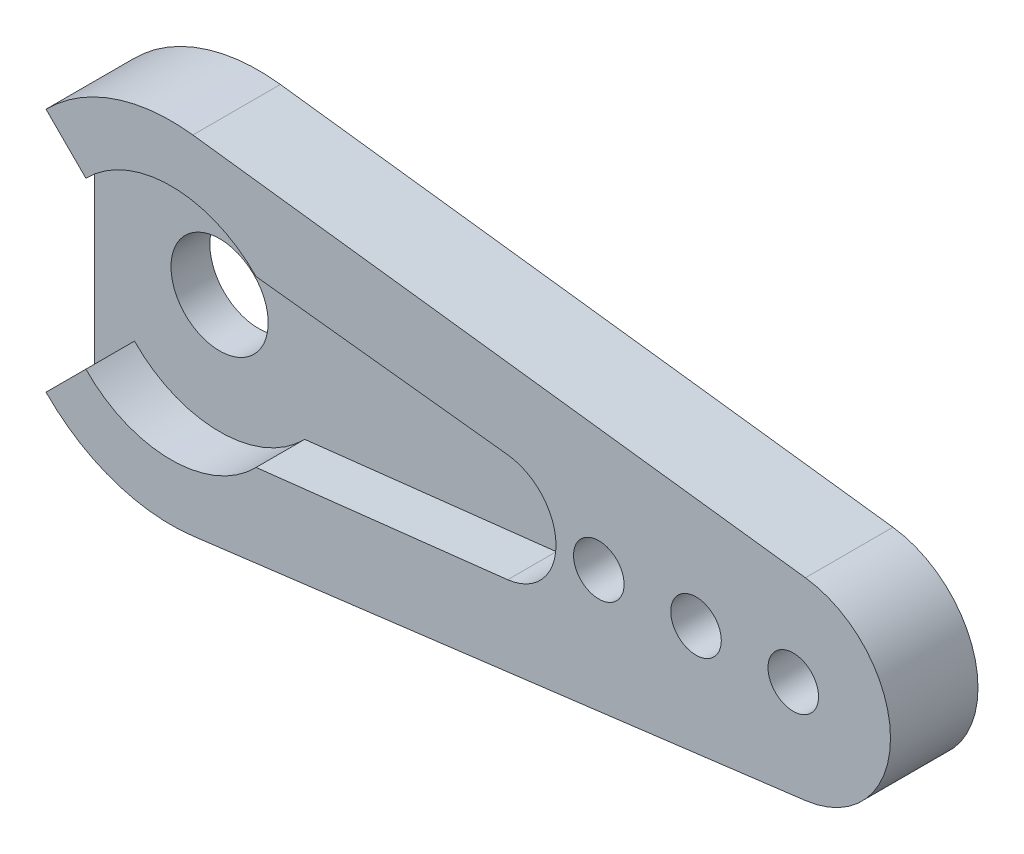
ISO-10303-21;
HEADER;
FILE_DESCRIPTION(('STEP AP214'),'2;1');
FILE_NAME('part.step','',(''),(''),'','','');
FILE_SCHEMA(('AUTOMOTIVE_DESIGN { 1 0 10303 214 1 1 1 1 }'));
ENDSEC;
DATA;
#1=APPLICATION_CONTEXT('core data for automotive mechanical design processes');
#2=APPLICATION_PROTOCOL_DEFINITION('international standard','automotive_design',2000,#1);
#3=PRODUCT_CONTEXT('',#1,'mechanical');
#4=PRODUCT('Part','Part','',(#3));
#5=PRODUCT_RELATED_PRODUCT_CATEGORY('part','',(#4));
#6=PRODUCT_DEFINITION_FORMATION('','',#4);
#7=PRODUCT_DEFINITION_CONTEXT('part definition',#1,'design');
#8=PRODUCT_DEFINITION('design','',#6,#7);
#9=PRODUCT_DEFINITION_SHAPE('','',#8);
#10=(LENGTH_UNIT() NAMED_UNIT(*) SI_UNIT(.MILLI.,.METRE.));
#11=(NAMED_UNIT(*) PLANE_ANGLE_UNIT() SI_UNIT($,.RADIAN.));
#12=(NAMED_UNIT(*) SI_UNIT($,.STERADIAN.) SOLID_ANGLE_UNIT());
#13=UNCERTAINTY_MEASURE_WITH_UNIT(LENGTH_MEASURE(1.E-05),#10,'distance_accuracy_value','');
#14=(GEOMETRIC_REPRESENTATION_CONTEXT(3) GLOBAL_UNCERTAINTY_ASSIGNED_CONTEXT((#13)) GLOBAL_UNIT_ASSIGNED_CONTEXT((#10,
#11,#12)) REPRESENTATION_CONTEXT('',''));
#15=CARTESIAN_POINT('',(0.,0.,0.));
#16=DIRECTION('',(0.,0.,1.));
#17=DIRECTION('',(1.,0.,0.));
#18=AXIS2_PLACEMENT_3D('',#15,#16,#17);
#19=CARTESIAN_POINT('',(0.,0.,2.5));
#20=DIRECTION('',(0.,0.,-1.));
#21=DIRECTION('',(-1.,0.,0.));
#22=AXIS2_PLACEMENT_3D('',#19,#20,#21);
#23=CYLINDRICAL_SURFACE('',#22,9.);
#24=DIRECTION('',(0.,0.,-1.));
#25=VECTOR('',#24,1.);
#26=CARTESIAN_POINT('',(1.125,8.92941067484299,2.5));
#27=LINE('',#26,#25);
#28=CARTESIAN_POINT('',(1.125,8.92941067484299,2.5));
#29=VERTEX_POINT('',#28);
#30=CARTESIAN_POINT('',(1.125,8.92941067484299,-2.));
#31=VERTEX_POINT('',#30);
#32=EDGE_CURVE('E185',#29,#31,#27,.T.);
#33=ORIENTED_EDGE('',*,*,#32,.T.);
#34=CARTESIAN_POINT('',(0.,0.,-2.));
#35=DIRECTION('',(0.,0.,-1.));
#36=DIRECTION('',(-1.,0.,0.));
#37=AXIS2_PLACEMENT_3D('',#34,#35,#36);
#38=CIRCLE('',#37,9.);
#39=CARTESIAN_POINT('',(-6.42654307097902,6.30075742723457,-2.));
#40=VERTEX_POINT('',#39);
#41=EDGE_CURVE('E135',#40,#31,#38,.T.);
#42=ORIENTED_EDGE('',*,*,#41,.F.);
#43=DIRECTION('',(0.,0.,1.));
#44=VECTOR('',#43,1.);
#45=CARTESIAN_POINT('',(-6.42654307097902,6.30075742723457,-2.));
#46=LINE('',#45,#44);
#47=CARTESIAN_POINT('',(-6.42654307097902,6.30075742723457,0.));
#48=VERTEX_POINT('',#47);
#49=EDGE_CURVE('E131',#40,#48,#46,.T.);
#50=ORIENTED_EDGE('',*,*,#49,.T.);
#51=DIRECTION('',(0.,0.,-1.));
#52=VECTOR('',#51,1.);
#53=CARTESIAN_POINT('',(-6.42654307097901,6.30075742723457,2.5));
#54=LINE('',#53,#52);
#55=CARTESIAN_POINT('',(-6.42654307097901,6.30075742723457,2.5));
#56=VERTEX_POINT('',#55);
#57=EDGE_CURVE('E11',#56,#48,#54,.T.);
#58=ORIENTED_EDGE('',*,*,#57,.F.);
#59=CARTESIAN_POINT('',(0.,0.,2.5));
#60=DIRECTION('',(0.,0.,1.));
#61=DIRECTION('',(-1.,0.,0.));
#62=AXIS2_PLACEMENT_3D('',#59,#60,#61);
#63=CIRCLE('',#62,9.);
#64=EDGE_CURVE('E162',#29,#56,#63,.T.);
#65=ORIENTED_EDGE('',*,*,#64,.F.);
#66=EDGE_LOOP('',(#33,#42,#50,#58,#65));
#67=FACE_BOUND('',#66,.T.);
#68=ADVANCED_FACE('F33',(#67),#23,.T.);
#69=CARTESIAN_POINT('',(-4.37578564374445,4.25,2.5));
#70=DIRECTION('',(0.707106781186548,0.707106781186548,0.));
#71=DIRECTION('',(-0.707106781186548,0.707106781186548,0.));
#72=AXIS2_PLACEMENT_3D('',#69,#70,#71);
#73=PLANE('',#72);
#74=DIRECTION('',(0.707106781186548,-0.707106781186548,0.));
#75=VECTOR('',#74,1.);
#76=CARTESIAN_POINT('',(-4.37578564374445,4.25,0.));
#77=LINE('',#76,#75);
#78=CARTESIAN_POINT('',(-4.37578564374445,4.25,0.));
#79=VERTEX_POINT('',#78);
#80=EDGE_CURVE('E154',#48,#79,#77,.T.);
#81=ORIENTED_EDGE('',*,*,#80,.T.);
#82=DIRECTION('',(0.,0.,-1.));
#83=VECTOR('',#82,1.);
#84=CARTESIAN_POINT('',(-4.37578564374445,4.25,2.5));
#85=LINE('',#84,#83);
#86=CARTESIAN_POINT('',(-4.37578564374445,4.25,2.5));
#87=VERTEX_POINT('',#86);
#88=EDGE_CURVE('E41',#87,#79,#85,.T.);
#89=ORIENTED_EDGE('',*,*,#88,.F.);
#90=DIRECTION('',(0.707106781186548,-0.707106781186548,0.));
#91=VECTOR('',#90,1.);
#92=CARTESIAN_POINT('',(-4.37578564374445,4.25,2.5));
#93=LINE('',#92,#91);
#94=EDGE_CURVE('E164',#56,#87,#93,.T.);
#95=ORIENTED_EDGE('',*,*,#94,.F.);
#96=ORIENTED_EDGE('',*,*,#57,.T.);
#97=EDGE_LOOP('',(#81,#89,#95,#96));
#98=FACE_BOUND('',#97,.T.);
#99=ADVANCED_FACE('F232',(#98),#73,.F.);
#100=CARTESIAN_POINT('',(0.,0.,2.5));
#101=DIRECTION('',(0.,0.,-1.));
#102=DIRECTION('',(-1.,0.,0.));
#103=AXIS2_PLACEMENT_3D('',#100,#101,#102);
#104=CYLINDRICAL_SURFACE('',#103,6.1);
#105=CARTESIAN_POINT('',(0.,0.,0.));
#106=DIRECTION('',(0.,0.,-1.));
#107=DIRECTION('',(1.,0.,0.));
#108=AXIS2_PLACEMENT_3D('',#105,#106,#107);
#109=CIRCLE('',#108,6.1);
#110=CARTESIAN_POINT('',(4.37578564374445,4.25,0.));
#111=VERTEX_POINT('',#110);
#112=EDGE_CURVE('E157',#79,#111,#109,.T.);
#113=ORIENTED_EDGE('',*,*,#112,.T.);
#114=DIRECTION('',(0.,0.,-1.));
#115=VECTOR('',#114,1.);
#116=CARTESIAN_POINT('',(4.37578564374445,4.25,2.5));
#117=LINE('',#116,#115);
#118=CARTESIAN_POINT('',(4.37578564374445,4.25,2.5));
#119=VERTEX_POINT('',#118);
#120=EDGE_CURVE('E222',#119,#111,#117,.T.);
#121=ORIENTED_EDGE('',*,*,#120,.F.);
#122=CARTESIAN_POINT('',(0.,0.,2.5));
#123=DIRECTION('',(0.,0.,-1.));
#124=DIRECTION('',(1.,0.,0.));
#125=AXIS2_PLACEMENT_3D('',#122,#123,#124);
#126=CIRCLE('',#125,6.1);
#127=EDGE_CURVE('E167',#87,#119,#126,.T.);
#128=ORIENTED_EDGE('',*,*,#127,.F.);
#129=ORIENTED_EDGE('',*,*,#88,.T.);
#130=EDGE_LOOP('',(#113,#121,#128,#129));
#131=FACE_BOUND('',#130,.T.);
#132=ADVANCED_FACE('F228',(#131),#104,.F.);
#133=CARTESIAN_POINT('',(4.37578564374445,4.25,2.5));
#134=DIRECTION('',(0.112713317991759,0.993627549913592,0.));
#135=DIRECTION('',(-0.993627549913592,0.112713317991759,0.));
#136=AXIS2_PLACEMENT_3D('',#133,#134,#135);
#137=PLANE('',#136);
#138=DIRECTION('',(0.993627549913592,-0.112713317991759,0.));
#139=VECTOR('',#138,1.);
#140=CARTESIAN_POINT('',(4.37578564374445,4.25,0.));
#141=LINE('',#140,#139);
#142=CARTESIAN_POINT('',(17.3155972903769,2.78215713975806,0.));
#143=VERTEX_POINT('',#142);
#144=EDGE_CURVE('E189',#111,#143,#141,.T.);
#145=ORIENTED_EDGE('',*,*,#144,.T.);
#146=DIRECTION('',(0.,0.,-1.));
#147=VECTOR('',#146,1.);
#148=CARTESIAN_POINT('',(17.3155972903769,2.78215713975806,2.5));
#149=LINE('',#148,#147);
#150=CARTESIAN_POINT('',(17.3155972903769,2.78215713975806,2.5));
#151=VERTEX_POINT('',#150);
#152=EDGE_CURVE('E219',#151,#143,#149,.T.);
#153=ORIENTED_EDGE('',*,*,#152,.F.);
#154=DIRECTION('',(0.993627549913592,-0.112713317991759,0.));
#155=VECTOR('',#154,1.);
#156=CARTESIAN_POINT('',(4.37578564374445,4.25,2.5));
#157=LINE('',#156,#155);
#158=EDGE_CURVE('E169',#119,#151,#157,.T.);
#159=ORIENTED_EDGE('',*,*,#158,.F.);
#160=ORIENTED_EDGE('',*,*,#120,.T.);
#161=EDGE_LOOP('',(#145,#153,#159,#160));
#162=FACE_BOUND('',#161,.T.);
#163=ADVANCED_FACE('F275',(#162),#137,.F.);
#164=CARTESIAN_POINT('',(17.,0.,2.5));
#165=DIRECTION('',(0.,0.,-1.));
#166=DIRECTION('',(-1.,0.,0.));
#167=AXIS2_PLACEMENT_3D('',#164,#165,#166);
#168=CYLINDRICAL_SURFACE('',#167,2.8);
#169=CARTESIAN_POINT('',(17.,0.,0.));
#170=DIRECTION('',(0.,0.,-1.));
#171=DIRECTION('',(1.,0.,0.));
#172=AXIS2_PLACEMENT_3D('',#169,#170,#171);
#173=CIRCLE('',#172,2.8);
#174=CARTESIAN_POINT('',(17.3155972903769,-2.78215713975806,0.));
#175=VERTEX_POINT('',#174);
#176=EDGE_CURVE('E192',#143,#175,#173,.T.);
#177=ORIENTED_EDGE('',*,*,#176,.T.);
#178=DIRECTION('',(0.,0.,-1.));
#179=VECTOR('',#178,1.);
#180=CARTESIAN_POINT('',(17.3155972903769,-2.78215713975806,2.5));
#181=LINE('',#180,#179);
#182=CARTESIAN_POINT('',(17.3155972903769,-2.78215713975806,2.5));
#183=VERTEX_POINT('',#182);
#184=EDGE_CURVE('E216',#183,#175,#181,.T.);
#185=ORIENTED_EDGE('',*,*,#184,.F.);
#186=CARTESIAN_POINT('',(17.,0.,2.5));
#187=DIRECTION('',(0.,0.,-1.));
#188=DIRECTION('',(1.,0.,0.));
#189=AXIS2_PLACEMENT_3D('',#186,#187,#188);
#190=CIRCLE('',#189,2.8);
#191=EDGE_CURVE('E171',#151,#183,#190,.T.);
#192=ORIENTED_EDGE('',*,*,#191,.F.);
#193=ORIENTED_EDGE('',*,*,#152,.T.);
#194=EDGE_LOOP('',(#177,#185,#192,#193));
#195=FACE_BOUND('',#194,.T.);
#196=ADVANCED_FACE('F270',(#195),#168,.F.);
#197=CARTESIAN_POINT('',(17.3155972903769,-2.78215713975806,2.5));
#198=DIRECTION('',(0.112713317991759,-0.993627549913592,0.));
#199=DIRECTION('',(0.993627549913592,0.112713317991759,0.));
#200=AXIS2_PLACEMENT_3D('',#197,#198,#199);
#201=PLANE('',#200);
#202=DIRECTION('',(-0.993627549913592,-0.112713317991759,0.));
#203=VECTOR('',#202,1.);
#204=CARTESIAN_POINT('',(17.3155972903769,-2.78215713975806,0.));
#205=LINE('',#204,#203);
#206=CARTESIAN_POINT('',(4.37578564374445,-4.25,0.));
#207=VERTEX_POINT('',#206);
#208=EDGE_CURVE('E195',#175,#207,#205,.T.);
#209=ORIENTED_EDGE('',*,*,#208,.T.);
#210=DIRECTION('',(0.,0.,-1.));
#211=VECTOR('',#210,1.);
#212=CARTESIAN_POINT('',(4.37578564374445,-4.25,2.5));
#213=LINE('',#212,#211);
#214=CARTESIAN_POINT('',(4.37578564374445,-4.25,2.5));
#215=VERTEX_POINT('',#214);
#216=EDGE_CURVE('E213',#215,#207,#213,.T.);
#217=ORIENTED_EDGE('',*,*,#216,.F.);
#218=DIRECTION('',(-0.993627549913592,-0.112713317991759,0.));
#219=VECTOR('',#218,1.);
#220=CARTESIAN_POINT('',(17.3155972903769,-2.78215713975806,2.5));
#221=LINE('',#220,#219);
#222=EDGE_CURVE('E173',#183,#215,#221,.T.);
#223=ORIENTED_EDGE('',*,*,#222,.F.);
#224=ORIENTED_EDGE('',*,*,#184,.T.);
#225=EDGE_LOOP('',(#209,#217,#223,#224));
#226=FACE_BOUND('',#225,.T.);
#227=ADVANCED_FACE('F267',(#226),#201,.F.);
#228=CARTESIAN_POINT('',(0.,0.,2.5));
#229=DIRECTION('',(0.,0.,-1.));
#230=DIRECTION('',(-1.,0.,0.));
#231=AXIS2_PLACEMENT_3D('',#228,#229,#230);
#232=CYLINDRICAL_SURFACE('',#231,6.1);
#233=CARTESIAN_POINT('',(0.,0.,0.));
#234=DIRECTION('',(0.,0.,-1.));
#235=DIRECTION('',(-1.,0.,0.));
#236=AXIS2_PLACEMENT_3D('',#233,#234,#235);
#237=CIRCLE('',#236,6.1);
#238=CARTESIAN_POINT('',(-4.37578564374444,-4.25,0.));
#239=VERTEX_POINT('',#238);
#240=EDGE_CURVE('E198',#207,#239,#237,.T.);
#241=ORIENTED_EDGE('',*,*,#240,.T.);
#242=DIRECTION('',(0.,0.,-1.));
#243=VECTOR('',#242,1.);
#244=CARTESIAN_POINT('',(-4.37578564374444,-4.25,2.5));
#245=LINE('',#244,#243);
#246=CARTESIAN_POINT('',(-4.37578564374444,-4.25,2.5));
#247=VERTEX_POINT('',#246);
#248=EDGE_CURVE('E210',#247,#239,#245,.T.);
#249=ORIENTED_EDGE('',*,*,#248,.F.);
#250=CARTESIAN_POINT('',(0.,0.,2.5));
#251=DIRECTION('',(0.,0.,-1.));
#252=DIRECTION('',(-1.,0.,0.));
#253=AXIS2_PLACEMENT_3D('',#250,#251,#252);
#254=CIRCLE('',#253,6.1);
#255=EDGE_CURVE('E175',#215,#247,#254,.T.);
#256=ORIENTED_EDGE('',*,*,#255,.F.);
#257=ORIENTED_EDGE('',*,*,#216,.T.);
#258=EDGE_LOOP('',(#241,#249,#256,#257));
#259=FACE_BOUND('',#258,.T.);
#260=ADVANCED_FACE('F263',(#259),#232,.F.);
#261=CARTESIAN_POINT('',(-4.37578564374445,-4.25,2.5));
#262=DIRECTION('',(0.707106781186548,-0.707106781186548,0.));
#263=DIRECTION('',(0.707106781186548,0.707106781186548,0.));
#264=AXIS2_PLACEMENT_3D('',#261,#262,#263);
#265=PLANE('',#264);
#266=DIRECTION('',(-0.707106781186548,-0.707106781186548,0.));
#267=VECTOR('',#266,1.);
#268=CARTESIAN_POINT('',(-4.37578564374445,-4.25,0.));
#269=LINE('',#268,#267);
#270=CARTESIAN_POINT('',(-6.42654307097901,-6.30075742723457,0.));
#271=VERTEX_POINT('',#270);
#272=EDGE_CURVE('E165',#239,#271,#269,.T.);
#273=ORIENTED_EDGE('',*,*,#272,.T.);
#274=DIRECTION('',(0.,0.,-1.));
#275=VECTOR('',#274,1.);
#276=CARTESIAN_POINT('',(-6.42654307097901,-6.30075742723457,2.5));
#277=LINE('',#276,#275);
#278=CARTESIAN_POINT('',(-6.42654307097901,-6.30075742723457,2.5));
#279=VERTEX_POINT('',#278);
#280=EDGE_CURVE('E153',#279,#271,#277,.T.);
#281=ORIENTED_EDGE('',*,*,#280,.F.);
#282=DIRECTION('',(-0.707106781186548,-0.707106781186548,0.));
#283=VECTOR('',#282,1.);
#284=CARTESIAN_POINT('',(-4.37578564374445,-4.25,2.5));
#285=LINE('',#284,#283);
#286=EDGE_CURVE('E177',#247,#279,#285,.T.);
#287=ORIENTED_EDGE('',*,*,#286,.F.);
#288=ORIENTED_EDGE('',*,*,#248,.T.);
#289=EDGE_LOOP('',(#273,#281,#287,#288));
#290=FACE_BOUND('',#289,.T.);
#291=ADVANCED_FACE('F261',(#290),#265,.F.);
#292=CARTESIAN_POINT('',(0.,0.,2.5));
#293=DIRECTION('',(0.,0.,-1.));
#294=DIRECTION('',(-1.,0.,0.));
#295=AXIS2_PLACEMENT_3D('',#292,#293,#294);
#296=CYLINDRICAL_SURFACE('',#295,9.);
#297=ORIENTED_EDGE('',*,*,#280,.T.);
#298=DIRECTION('',(0.,0.,1.));
#299=VECTOR('',#298,1.);
#300=CARTESIAN_POINT('',(-6.42654307097901,-6.30075742723457,-2.));
#301=LINE('',#300,#299);
#302=CARTESIAN_POINT('',(-6.42654307097901,-6.30075742723457,-2.));
#303=VERTEX_POINT('',#302);
#304=EDGE_CURVE('E128',#303,#271,#301,.T.);
#305=ORIENTED_EDGE('',*,*,#304,.F.);
#306=CARTESIAN_POINT('',(0.,0.,-2.));
#307=DIRECTION('',(0.,0.,-1.));
#308=DIRECTION('',(-1.,0.,0.));
#309=AXIS2_PLACEMENT_3D('',#306,#307,#308);
#310=CIRCLE('',#309,9.);
#311=CARTESIAN_POINT('',(1.125,-8.92941067484299,-2.));
#312=VERTEX_POINT('',#311);
#313=EDGE_CURVE('E136',#312,#303,#310,.T.);
#314=ORIENTED_EDGE('',*,*,#313,.F.);
#315=DIRECTION('',(0.,0.,-1.));
#316=VECTOR('',#315,1.);
#317=CARTESIAN_POINT('',(1.125,-8.92941067484299,2.5));
#318=LINE('',#317,#316);
#319=CARTESIAN_POINT('',(1.125,-8.92941067484299,2.5));
#320=VERTEX_POINT('',#319);
#321=EDGE_CURVE('E207',#320,#312,#318,.T.);
#322=ORIENTED_EDGE('',*,*,#321,.F.);
#323=CARTESIAN_POINT('',(0.,0.,2.5));
#324=DIRECTION('',(0.,0.,1.));
#325=DIRECTION('',(1.,0.,0.));
#326=AXIS2_PLACEMENT_3D('',#323,#324,#325);
#327=CIRCLE('',#326,9.);
#328=EDGE_CURVE('E179',#279,#320,#327,.T.);
#329=ORIENTED_EDGE('',*,*,#328,.F.);
#330=EDGE_LOOP('',(#297,#305,#314,#322,#329));
#331=FACE_BOUND('',#330,.T.);
#332=ADVANCED_FACE('F150',(#331),#296,.T.);
#333=CARTESIAN_POINT('',(1.125,-8.92941067484299,2.5));
#334=DIRECTION('',(-0.125,0.992156741649222,0.));
#335=DIRECTION('',(-0.992156741649222,-0.125,0.));
#336=AXIS2_PLACEMENT_3D('',#333,#334,#335);
#337=PLANE('',#336);
#338=ORIENTED_EDGE('',*,*,#321,.T.);
#339=DIRECTION('',(-0.992156741649221,-0.125,0.));
#340=VECTOR('',#339,1.);
#341=CARTESIAN_POINT('',(1.125,-8.92941067484299,-2.));
#342=LINE('',#341,#340);
#343=CARTESIAN_POINT('',(32.625,-4.96078370824611,-2.));
#344=VERTEX_POINT('',#343);
#345=EDGE_CURVE('E144',#344,#312,#342,.T.);
#346=ORIENTED_EDGE('',*,*,#345,.F.);
#347=DIRECTION('',(0.,0.,-1.));
#348=VECTOR('',#347,1.);
#349=CARTESIAN_POINT('',(32.625,-4.96078370824611,2.5));
#350=LINE('',#349,#348);
#351=CARTESIAN_POINT('',(32.625,-4.96078370824611,2.5));
#352=VERTEX_POINT('',#351);
#353=EDGE_CURVE('E205',#352,#344,#350,.T.);
#354=ORIENTED_EDGE('',*,*,#353,.F.);
#355=DIRECTION('',(0.992156741649221,0.125,0.));
#356=VECTOR('',#355,1.);
#357=CARTESIAN_POINT('',(1.125,-8.92941067484299,2.5));
#358=LINE('',#357,#356);
#359=EDGE_CURVE('E181',#320,#352,#358,.T.);
#360=ORIENTED_EDGE('',*,*,#359,.F.);
#361=EDGE_LOOP('',(#338,#346,#354,#360));
#362=FACE_BOUND('',#361,.T.);
#363=ADVANCED_FACE('F253',(#362),#337,.F.);
#364=CARTESIAN_POINT('',(32.,0.,2.5));
#365=DIRECTION('',(0.,0.,-1.));
#366=DIRECTION('',(-1.,0.,0.));
#367=AXIS2_PLACEMENT_3D('',#364,#365,#366);
#368=CYLINDRICAL_SURFACE('',#367,5.);
#369=ORIENTED_EDGE('',*,*,#353,.T.);
#370=CARTESIAN_POINT('',(32.,0.,-2.));
#371=DIRECTION('',(0.,0.,-1.));
#372=DIRECTION('',(-1.,0.,0.));
#373=AXIS2_PLACEMENT_3D('',#370,#371,#372);
#374=CIRCLE('',#373,5.);
#375=CARTESIAN_POINT('',(32.625,4.96078370824611,-2.));
#376=VERTEX_POINT('',#375);
#377=EDGE_CURVE('E244',#376,#344,#374,.T.);
#378=ORIENTED_EDGE('',*,*,#377,.F.);
#379=DIRECTION('',(0.,0.,-1.));
#380=VECTOR('',#379,1.);
#381=CARTESIAN_POINT('',(32.625,4.96078370824611,2.5));
#382=LINE('',#381,#380);
#383=CARTESIAN_POINT('',(32.625,4.96078370824611,2.5));
#384=VERTEX_POINT('',#383);
#385=EDGE_CURVE('E203',#384,#376,#382,.T.);
#386=ORIENTED_EDGE('',*,*,#385,.F.);
#387=CARTESIAN_POINT('',(32.,0.,2.5));
#388=DIRECTION('',(0.,0.,1.));
#389=DIRECTION('',(-1.,0.,0.));
#390=AXIS2_PLACEMENT_3D('',#387,#388,#389);
#391=CIRCLE('',#390,5.);
#392=EDGE_CURVE('E183',#352,#384,#391,.T.);
#393=ORIENTED_EDGE('',*,*,#392,.F.);
#394=EDGE_LOOP('',(#369,#378,#386,#393));
#395=FACE_BOUND('',#394,.T.);
#396=ADVANCED_FACE('F347',(#395),#368,.T.);
#397=CARTESIAN_POINT('',(1.125,8.92941067484299,2.5));
#398=DIRECTION('',(-0.125,-0.992156741649222,0.));
#399=DIRECTION('',(0.992156741649222,-0.125,0.));
#400=AXIS2_PLACEMENT_3D('',#397,#398,#399);
#401=PLANE('',#400);
#402=ORIENTED_EDGE('',*,*,#385,.T.);
#403=DIRECTION('',(0.992156741649221,-0.125,0.));
#404=VECTOR('',#403,1.);
#405=CARTESIAN_POINT('',(1.125,8.92941067484299,-2.));
#406=LINE('',#405,#404);
#407=EDGE_CURVE('E242',#31,#376,#406,.T.);
#408=ORIENTED_EDGE('',*,*,#407,.F.);
#409=ORIENTED_EDGE('',*,*,#32,.F.);
#410=DIRECTION('',(-0.992156741649221,0.125,0.));
#411=VECTOR('',#410,1.);
#412=CARTESIAN_POINT('',(1.125,8.92941067484299,2.5));
#413=LINE('',#412,#411);
#414=EDGE_CURVE('E48',#384,#29,#413,.T.);
#415=ORIENTED_EDGE('',*,*,#414,.F.);
#416=EDGE_LOOP('',(#402,#408,#409,#415));
#417=FACE_BOUND('',#416,.T.);
#418=ADVANCED_FACE('F357',(#417),#401,.F.);
#419=CARTESIAN_POINT('',(0.,0.,2.5));
#420=DIRECTION('',(0.,0.,-1.));
#421=DIRECTION('',(-1.,0.,0.));
#422=AXIS2_PLACEMENT_3D('',#419,#420,#421);
#423=PLANE('',#422);
#424=CARTESIAN_POINT('',(22.,0.,2.5));
#425=DIRECTION('',(0.,0.,1.));
#426=DIRECTION('',(1.,0.,0.));
#427=AXIS2_PLACEMENT_3D('',#424,#425,#426);
#428=CIRCLE('',#427,1.3);
#429=CARTESIAN_POINT('',(23.3,0.,2.5));
#430=VERTEX_POINT('',#429);
#431=EDGE_CURVE('E448',#430,#430,#428,.T.);
#432=ORIENTED_EDGE('',*,*,#431,.F.);
#433=EDGE_LOOP('',(#432));
#434=FACE_BOUND('',#433,.T.);
#435=CARTESIAN_POINT('',(27.,0.,2.5));
#436=DIRECTION('',(0.,0.,1.));
#437=DIRECTION('',(1.,0.,0.));
#438=AXIS2_PLACEMENT_3D('',#435,#436,#437);
#439=CIRCLE('',#438,1.3);
#440=CARTESIAN_POINT('',(28.3,0.,2.5));
#441=VERTEX_POINT('',#440);
#442=EDGE_CURVE('E454',#441,#441,#439,.T.);
#443=ORIENTED_EDGE('',*,*,#442,.F.);
#444=EDGE_LOOP('',(#443));
#445=FACE_BOUND('',#444,.T.);
#446=CARTESIAN_POINT('',(32.,0.,2.5));
#447=DIRECTION('',(0.,0.,1.));
#448=DIRECTION('',(1.,0.,0.));
#449=AXIS2_PLACEMENT_3D('',#446,#447,#448);
#450=CIRCLE('',#449,1.3);
#451=CARTESIAN_POINT('',(33.3,0.,2.5));
#452=VERTEX_POINT('',#451);
#453=EDGE_CURVE('E451',#452,#452,#450,.T.);
#454=ORIENTED_EDGE('',*,*,#453,.F.);
#455=EDGE_LOOP('',(#454));
#456=FACE_BOUND('',#455,.T.);
#457=ORIENTED_EDGE('',*,*,#64,.T.);
#458=ORIENTED_EDGE('',*,*,#94,.T.);
#459=ORIENTED_EDGE('',*,*,#127,.T.);
#460=ORIENTED_EDGE('',*,*,#158,.T.);
#461=ORIENTED_EDGE('',*,*,#191,.T.);
#462=ORIENTED_EDGE('',*,*,#222,.T.);
#463=ORIENTED_EDGE('',*,*,#255,.T.);
#464=ORIENTED_EDGE('',*,*,#286,.T.);
#465=ORIENTED_EDGE('',*,*,#328,.T.);
#466=ORIENTED_EDGE('',*,*,#359,.T.);
#467=ORIENTED_EDGE('',*,*,#392,.T.);
#468=ORIENTED_EDGE('',*,*,#414,.T.);
#469=EDGE_LOOP('',(#457,#458,#459,#460,#461,#462,#463,#464,#465,#466,#467,#468));
#470=FACE_BOUND('',#469,.T.);
#471=ADVANCED_FACE('F256',(#434,#445,#456,#470),#423,.F.);
#472=CARTESIAN_POINT('',(0.,0.,-2.));
#473=DIRECTION('',(0.,0.,-1.));
#474=DIRECTION('',(-1.,0.,0.));
#475=AXIS2_PLACEMENT_3D('',#472,#473,#474);
#476=PLANE('',#475);
#477=CARTESIAN_POINT('',(22.,0.,-2.));
#478=DIRECTION('',(0.,0.,1.));
#479=DIRECTION('',(1.,0.,0.));
#480=AXIS2_PLACEMENT_3D('',#477,#478,#479);
#481=CIRCLE('',#480,1.3);
#482=CARTESIAN_POINT('',(23.3,0.,-2.));
#483=VERTEX_POINT('',#482);
#484=EDGE_CURVE('E445',#483,#483,#481,.T.);
#485=ORIENTED_EDGE('',*,*,#484,.T.);
#486=EDGE_LOOP('',(#485));
#487=FACE_BOUND('',#486,.T.);
#488=CARTESIAN_POINT('',(27.,0.,-2.));
#489=DIRECTION('',(0.,0.,1.));
#490=DIRECTION('',(1.,0.,0.));
#491=AXIS2_PLACEMENT_3D('',#488,#489,#490);
#492=CIRCLE('',#491,1.3);
#493=CARTESIAN_POINT('',(28.3,0.,-2.));
#494=VERTEX_POINT('',#493);
#495=EDGE_CURVE('E449',#494,#494,#492,.T.);
#496=ORIENTED_EDGE('',*,*,#495,.T.);
#497=EDGE_LOOP('',(#496));
#498=FACE_BOUND('',#497,.T.);
#499=CARTESIAN_POINT('',(32.,0.,-2.));
#500=DIRECTION('',(0.,0.,1.));
#501=DIRECTION('',(1.,0.,0.));
#502=AXIS2_PLACEMENT_3D('',#499,#500,#501);
#503=CIRCLE('',#502,1.3);
#504=CARTESIAN_POINT('',(33.3,0.,-2.));
#505=VERTEX_POINT('',#504);
#506=EDGE_CURVE('E459',#505,#505,#503,.T.);
#507=ORIENTED_EDGE('',*,*,#506,.T.);
#508=EDGE_LOOP('',(#507));
#509=FACE_BOUND('',#508,.T.);
#510=ORIENTED_EDGE('',*,*,#313,.T.);
#511=DIRECTION('',(0.,1.,0.));
#512=VECTOR('',#511,1.);
#513=CARTESIAN_POINT('',(-6.42654307097901,-6.30075742723457,-2.));
#514=LINE('',#513,#512);
#515=EDGE_CURVE('E123',#303,#40,#514,.T.);
#516=ORIENTED_EDGE('',*,*,#515,.T.);
#517=ORIENTED_EDGE('',*,*,#41,.T.);
#518=ORIENTED_EDGE('',*,*,#407,.T.);
#519=ORIENTED_EDGE('',*,*,#377,.T.);
#520=ORIENTED_EDGE('',*,*,#345,.T.);
#521=EDGE_LOOP('',(#510,#516,#517,#518,#519,#520));
#522=FACE_BOUND('',#521,.T.);
#523=CARTESIAN_POINT('',(0.,0.,-2.));
#524=DIRECTION('',(0.,0.,-1.));
#525=DIRECTION('',(-1.,0.,0.));
#526=AXIS2_PLACEMENT_3D('',#523,#524,#525);
#527=CIRCLE('',#526,2.5);
#528=CARTESIAN_POINT('',(-2.5,0.,-2.));
#529=VERTEX_POINT('',#528);
#530=EDGE_CURVE('E237',#529,#529,#527,.T.);
#531=ORIENTED_EDGE('',*,*,#530,.F.);
#532=EDGE_LOOP('',(#531));
#533=FACE_BOUND('',#532,.T.);
#534=ADVANCED_FACE('F140',(#487,#498,#509,#522,#533),#476,.T.);
#535=CARTESIAN_POINT('',(0.,0.,0.));
#536=DIRECTION('',(0.,0.,-1.));
#537=DIRECTION('',(-1.,0.,0.));
#538=AXIS2_PLACEMENT_3D('',#535,#536,#537);
#539=PLANE('',#538);
#540=ORIENTED_EDGE('',*,*,#272,.F.);
#541=ORIENTED_EDGE('',*,*,#240,.F.);
#542=ORIENTED_EDGE('',*,*,#208,.F.);
#543=ORIENTED_EDGE('',*,*,#176,.F.);
#544=ORIENTED_EDGE('',*,*,#144,.F.);
#545=ORIENTED_EDGE('',*,*,#112,.F.);
#546=ORIENTED_EDGE('',*,*,#80,.F.);
#547=DIRECTION('',(0.,1.,0.));
#548=VECTOR('',#547,1.);
#549=CARTESIAN_POINT('',(-6.42654307097901,-6.30075742723457,0.));
#550=LINE('',#549,#548);
#551=EDGE_CURVE('E147',#271,#48,#550,.T.);
#552=ORIENTED_EDGE('',*,*,#551,.F.);
#553=EDGE_LOOP('',(#540,#541,#542,#543,#544,#545,#546,#552));
#554=FACE_BOUND('',#553,.T.);
#555=CARTESIAN_POINT('',(0.,0.,0.));
#556=DIRECTION('',(0.,0.,-1.));
#557=DIRECTION('',(-1.,0.,0.));
#558=AXIS2_PLACEMENT_3D('',#555,#556,#557);
#559=CIRCLE('',#558,2.5);
#560=CARTESIAN_POINT('',(-2.5,0.,0.));
#561=VERTEX_POINT('',#560);
#562=EDGE_CURVE('E462',#561,#561,#559,.T.);
#563=ORIENTED_EDGE('',*,*,#562,.T.);
#564=EDGE_LOOP('',(#563));
#565=FACE_BOUND('',#564,.T.);
#566=ADVANCED_FACE('F235',(#554,#565),#539,.F.);
#567=CARTESIAN_POINT('',(-6.42654307097901,-6.30075742723457,-2.));
#568=DIRECTION('',(1.,0.,0.));
#569=DIRECTION('',(0.,0.,-1.));
#570=AXIS2_PLACEMENT_3D('',#567,#568,#569);
#571=PLANE('',#570);
#572=ORIENTED_EDGE('',*,*,#551,.T.);
#573=ORIENTED_EDGE('',*,*,#49,.F.);
#574=ORIENTED_EDGE('',*,*,#515,.F.);
#575=ORIENTED_EDGE('',*,*,#304,.T.);
#576=EDGE_LOOP('',(#572,#573,#574,#575));
#577=FACE_BOUND('',#576,.T.);
#578=ADVANCED_FACE('F126',(#577),#571,.F.);
#579=CARTESIAN_POINT('',(0.,0.,-2.));
#580=DIRECTION('',(0.,0.,1.));
#581=DIRECTION('',(1.,0.,0.));
#582=AXIS2_PLACEMENT_3D('',#579,#580,#581);
#583=CYLINDRICAL_SURFACE('',#582,2.5);
#584=ORIENTED_EDGE('',*,*,#530,.T.);
#585=EDGE_LOOP('',(#584));
#586=FACE_BOUND('',#585,.T.);
#587=ORIENTED_EDGE('',*,*,#562,.F.);
#588=EDGE_LOOP('',(#587));
#589=FACE_BOUND('',#588,.T.);
#590=ADVANCED_FACE('F388',(#586,#589),#583,.F.);
#591=CARTESIAN_POINT('',(32.,0.,-2.));
#592=DIRECTION('',(0.,0.,1.));
#593=DIRECTION('',(1.,0.,0.));
#594=AXIS2_PLACEMENT_3D('',#591,#592,#593);
#595=CYLINDRICAL_SURFACE('',#594,1.3);
#596=ORIENTED_EDGE('',*,*,#506,.F.);
#597=EDGE_LOOP('',(#596));
#598=FACE_BOUND('',#597,.T.);
#599=ORIENTED_EDGE('',*,*,#453,.T.);
#600=EDGE_LOOP('',(#599));
#601=FACE_BOUND('',#600,.T.);
#602=ADVANCED_FACE('F397',(#598,#601),#595,.F.);
#603=CARTESIAN_POINT('',(27.,0.,-2.));
#604=DIRECTION('',(0.,0.,1.));
#605=DIRECTION('',(1.,0.,0.));
#606=AXIS2_PLACEMENT_3D('',#603,#604,#605);
#607=CYLINDRICAL_SURFACE('',#606,1.3);
#608=ORIENTED_EDGE('',*,*,#495,.F.);
#609=EDGE_LOOP('',(#608));
#610=FACE_BOUND('',#609,.T.);
#611=ORIENTED_EDGE('',*,*,#442,.T.);
#612=EDGE_LOOP('',(#611));
#613=FACE_BOUND('',#612,.T.);
#614=ADVANCED_FACE('F418',(#610,#613),#607,.F.);
#615=CARTESIAN_POINT('',(22.,0.,-2.));
#616=DIRECTION('',(0.,0.,1.));
#617=DIRECTION('',(1.,0.,0.));
#618=AXIS2_PLACEMENT_3D('',#615,#616,#617);
#619=CYLINDRICAL_SURFACE('',#618,1.3);
#620=ORIENTED_EDGE('',*,*,#484,.F.);
#621=EDGE_LOOP('',(#620));
#622=FACE_BOUND('',#621,.T.);
#623=ORIENTED_EDGE('',*,*,#431,.T.);
#624=EDGE_LOOP('',(#623));
#625=FACE_BOUND('',#624,.T.);
#626=ADVANCED_FACE('F428',(#622,#625),#619,.F.);
#627=CLOSED_SHELL('',(#68,#99,#132,#163,#196,#227,#260,#291,#332,#363,#396,#418,#471,#534,#566,
#578,#590,#602,#614,#626));
#628=MANIFOLD_SOLID_BREP('B2',#627);
#629=ADVANCED_BREP_SHAPE_REPRESENTATION('',(#18,#628),#14);
#630=SHAPE_DEFINITION_REPRESENTATION(#9,#629);
ENDSEC;
END-ISO-10303-21;
